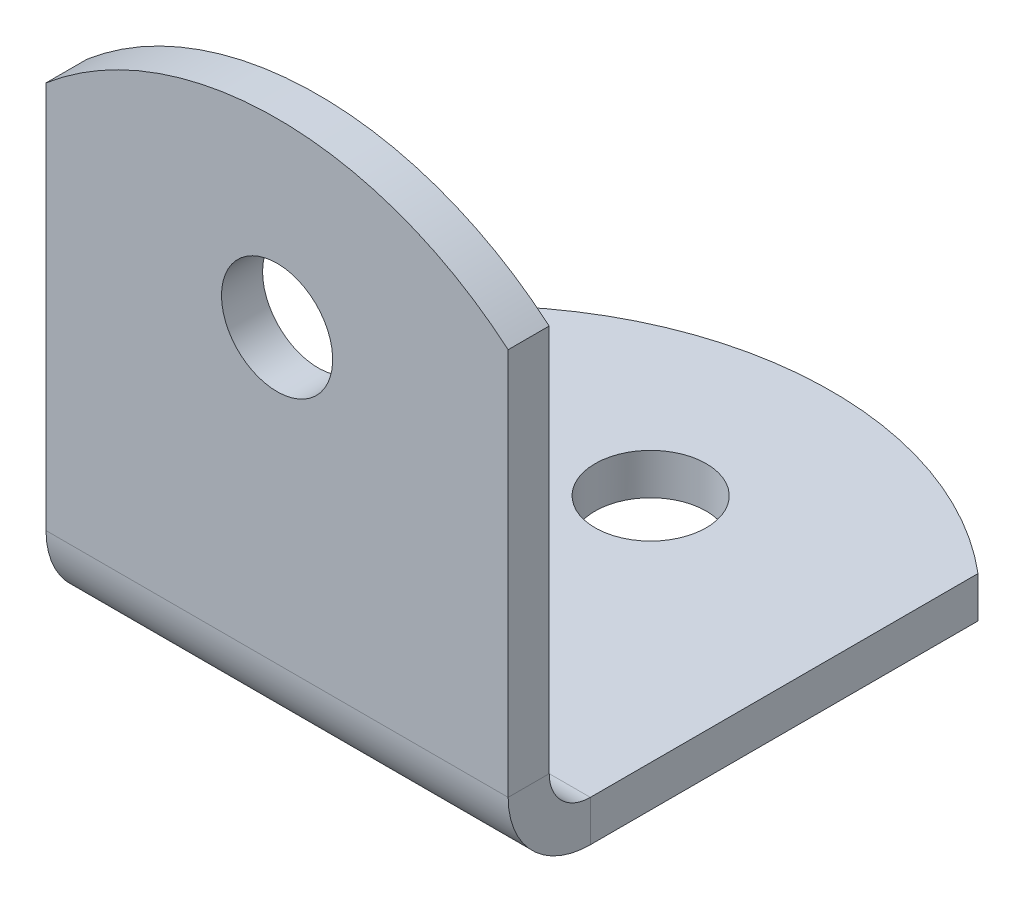
ISO-10303-21;
HEADER;
FILE_DESCRIPTION(('STEP AP214'),'2;1');
FILE_NAME('part.step','',(''),(''),'','','');
FILE_SCHEMA(('AUTOMOTIVE_DESIGN { 1 0 10303 214 1 1 1 1 }'));
ENDSEC;
DATA;
#1=APPLICATION_CONTEXT('core data for automotive mechanical design processes');
#2=APPLICATION_PROTOCOL_DEFINITION('international standard','automotive_design',2000,#1);
#3=PRODUCT_CONTEXT('',#1,'mechanical');
#4=PRODUCT('Part','Part','',(#3));
#5=PRODUCT_RELATED_PRODUCT_CATEGORY('part','',(#4));
#6=PRODUCT_DEFINITION_FORMATION('','',#4);
#7=PRODUCT_DEFINITION_CONTEXT('part definition',#1,'design');
#8=PRODUCT_DEFINITION('design','',#6,#7);
#9=PRODUCT_DEFINITION_SHAPE('','',#8);
#10=(LENGTH_UNIT() NAMED_UNIT(*) SI_UNIT(.MILLI.,.METRE.));
#11=(NAMED_UNIT(*) PLANE_ANGLE_UNIT() SI_UNIT($,.RADIAN.));
#12=(NAMED_UNIT(*) SI_UNIT($,.STERADIAN.) SOLID_ANGLE_UNIT());
#13=UNCERTAINTY_MEASURE_WITH_UNIT(LENGTH_MEASURE(1.E-05),#10,'distance_accuracy_value','');
#14=(GEOMETRIC_REPRESENTATION_CONTEXT(3) GLOBAL_UNCERTAINTY_ASSIGNED_CONTEXT((#13)) GLOBAL_UNIT_ASSIGNED_CONTEXT((#10,
#11,#12)) REPRESENTATION_CONTEXT('',''));
#15=CARTESIAN_POINT('',(0.,0.,0.));
#16=DIRECTION('',(0.,0.,1.));
#17=DIRECTION('',(1.,0.,0.));
#18=AXIS2_PLACEMENT_3D('',#15,#16,#17);
#19=CARTESIAN_POINT('',(0.,0.,-1.5));
#20=DIRECTION('',(-1.,0.,0.));
#21=DIRECTION('',(0.,1.,0.));
#22=AXIS2_PLACEMENT_3D('',#19,#20,#21);
#23=PLANE('',#22);
#24=DIRECTION('',(0.,0.,-1.));
#25=VECTOR('',#24,1.);
#26=CARTESIAN_POINT('',(0.,3.1,-1.5));
#27=LINE('',#26,#25);
#28=CARTESIAN_POINT('',(0.,3.1,0.0999999999999998));
#29=VERTEX_POINT('',#28);
#30=CARTESIAN_POINT('',(0.,3.1,-1.5));
#31=VERTEX_POINT('',#30);
#32=EDGE_CURVE('E11',#29,#31,#27,.T.);
#33=ORIENTED_EDGE('',*,*,#32,.F.);
#34=DIRECTION('',(0.,1.,0.));
#35=VECTOR('',#34,1.);
#36=CARTESIAN_POINT('',(0.,0.,0.1));
#37=LINE('',#36,#35);
#38=CARTESIAN_POINT('',(0.,18.2,0.1));
#39=VERTEX_POINT('',#38);
#40=EDGE_CURVE('E85',#39,#29,#37,.F.);
#41=ORIENTED_EDGE('',*,*,#40,.F.);
#42=DIRECTION('',(0.,0.,-1.));
#43=VECTOR('',#42,1.);
#44=CARTESIAN_POINT('',(0.,18.2,-1.5));
#45=LINE('',#44,#43);
#46=CARTESIAN_POINT('',(0.,18.2,-1.5));
#47=VERTEX_POINT('',#46);
#48=EDGE_CURVE('E46',#39,#47,#45,.T.);
#49=ORIENTED_EDGE('',*,*,#48,.T.);
#50=DIRECTION('',(0.,1.,0.));
#51=VECTOR('',#50,1.);
#52=CARTESIAN_POINT('',(0.,0.,-1.5));
#53=LINE('',#52,#51);
#54=EDGE_CURVE('E87',#47,#31,#53,.F.);
#55=ORIENTED_EDGE('',*,*,#54,.T.);
#56=EDGE_LOOP('',(#33,#41,#49,#55));
#57=FACE_BOUND('',#56,.T.);
#58=ADVANCED_FACE('F36',(#57),#23,.T.);
#59=CARTESIAN_POINT('',(9.,7.57727272727273,-1.5));
#60=DIRECTION('',(0.,0.,1.));
#61=DIRECTION('',(1.,0.,0.));
#62=AXIS2_PLACEMENT_3D('',#59,#60,#61);
#63=CYLINDRICAL_SURFACE('',#62,13.9227272727273);
#64=ORIENTED_EDGE('',*,*,#48,.F.);
#65=CARTESIAN_POINT('',(9.,7.57727272727273,0.1));
#66=DIRECTION('',(0.,0.,1.));
#67=DIRECTION('',(1.,0.,0.));
#68=AXIS2_PLACEMENT_3D('',#65,#66,#67);
#69=CIRCLE('',#68,13.9227272727273);
#70=CARTESIAN_POINT('',(18.,18.2,0.1));
#71=VERTEX_POINT('',#70);
#72=EDGE_CURVE('E111',#71,#39,#69,.T.);
#73=ORIENTED_EDGE('',*,*,#72,.F.);
#74=DIRECTION('',(0.,0.,-1.));
#75=VECTOR('',#74,1.);
#76=CARTESIAN_POINT('',(18.,18.2,-1.5));
#77=LINE('',#76,#75);
#78=CARTESIAN_POINT('',(18.,18.2,-1.5));
#79=VERTEX_POINT('',#78);
#80=EDGE_CURVE('E138',#71,#79,#77,.T.);
#81=ORIENTED_EDGE('',*,*,#80,.T.);
#82=CARTESIAN_POINT('',(9.,7.57727272727273,-1.5));
#83=DIRECTION('',(0.,0.,1.));
#84=DIRECTION('',(1.,0.,0.));
#85=AXIS2_PLACEMENT_3D('',#82,#83,#84);
#86=CIRCLE('',#85,13.9227272727273);
#87=EDGE_CURVE('E151',#79,#47,#86,.T.);
#88=ORIENTED_EDGE('',*,*,#87,.T.);
#89=EDGE_LOOP('',(#64,#73,#81,#88));
#90=FACE_BOUND('',#89,.T.);
#91=ADVANCED_FACE('F158',(#90),#63,.T.);
#92=CARTESIAN_POINT('',(18.,0.,-1.5));
#93=DIRECTION('',(-1.,0.,0.));
#94=DIRECTION('',(0.,1.,0.));
#95=AXIS2_PLACEMENT_3D('',#92,#93,#94);
#96=PLANE('',#95);
#97=ORIENTED_EDGE('',*,*,#80,.F.);
#98=DIRECTION('',(0.,1.,0.));
#99=VECTOR('',#98,1.);
#100=CARTESIAN_POINT('',(18.,0.,0.1));
#101=LINE('',#100,#99);
#102=CARTESIAN_POINT('',(18.,3.1,0.1));
#103=VERTEX_POINT('',#102);
#104=EDGE_CURVE('E113',#71,#103,#101,.F.);
#105=ORIENTED_EDGE('',*,*,#104,.T.);
#106=DIRECTION('',(0.,0.,-1.));
#107=VECTOR('',#106,1.);
#108=CARTESIAN_POINT('',(18.,3.1,-1.5));
#109=LINE('',#108,#107);
#110=CARTESIAN_POINT('',(18.,3.1,-1.5));
#111=VERTEX_POINT('',#110);
#112=EDGE_CURVE('E135',#103,#111,#109,.T.);
#113=ORIENTED_EDGE('',*,*,#112,.T.);
#114=DIRECTION('',(0.,1.,0.));
#115=VECTOR('',#114,1.);
#116=CARTESIAN_POINT('',(18.,0.,-1.5));
#117=LINE('',#116,#115);
#118=EDGE_CURVE('E156',#79,#111,#117,.F.);
#119=ORIENTED_EDGE('',*,*,#118,.F.);
#120=EDGE_LOOP('',(#97,#105,#113,#119));
#121=FACE_BOUND('',#120,.T.);
#122=ADVANCED_FACE('F193',(#121),#96,.F.);
#123=CARTESIAN_POINT('',(18.,3.1,-3.1));
#124=DIRECTION('',(-1.,0.,0.));
#125=DIRECTION('',(0.,0.,1.));
#126=AXIS2_PLACEMENT_3D('',#123,#124,#125);
#127=PLANE('',#126);
#128=ORIENTED_EDGE('',*,*,#112,.F.);
#129=CARTESIAN_POINT('',(18.,3.1,-3.1));
#130=DIRECTION('',(1.,0.,0.));
#131=DIRECTION('',(0.,0.,-1.));
#132=AXIS2_PLACEMENT_3D('',#129,#130,#131);
#133=CIRCLE('',#132,3.2);
#134=CARTESIAN_POINT('',(18.,-0.0999999999999998,-3.1));
#135=VERTEX_POINT('',#134);
#136=EDGE_CURVE('E101',#103,#135,#133,.T.);
#137=ORIENTED_EDGE('',*,*,#136,.T.);
#138=DIRECTION('',(0.,1.,0.));
#139=VECTOR('',#138,1.);
#140=CARTESIAN_POINT('',(18.,1.5,-3.1));
#141=LINE('',#140,#139);
#142=CARTESIAN_POINT('',(18.,1.5,-3.1));
#143=VERTEX_POINT('',#142);
#144=EDGE_CURVE('E133',#135,#143,#141,.T.);
#145=ORIENTED_EDGE('',*,*,#144,.T.);
#146=CARTESIAN_POINT('',(18.,3.1,-3.1));
#147=DIRECTION('',(1.,0.,0.));
#148=DIRECTION('',(0.,0.,-1.));
#149=AXIS2_PLACEMENT_3D('',#146,#147,#148);
#150=CIRCLE('',#149,1.6);
#151=EDGE_CURVE('E163',#111,#143,#150,.T.);
#152=ORIENTED_EDGE('',*,*,#151,.F.);
#153=EDGE_LOOP('',(#128,#137,#145,#152));
#154=FACE_BOUND('',#153,.T.);
#155=ADVANCED_FACE('F200',(#154),#127,.F.);
#156=CARTESIAN_POINT('',(18.,1.5,0.));
#157=DIRECTION('',(1.,0.,0.));
#158=DIRECTION('',(0.,0.,-1.));
#159=AXIS2_PLACEMENT_3D('',#156,#157,#158);
#160=PLANE('',#159);
#161=ORIENTED_EDGE('',*,*,#144,.F.);
#162=DIRECTION('',(0.,0.,1.));
#163=VECTOR('',#162,1.);
#164=CARTESIAN_POINT('',(18.,-0.1,0.));
#165=LINE('',#164,#163);
#166=CARTESIAN_POINT('',(18.,-0.1,-18.2));
#167=VERTEX_POINT('',#166);
#168=EDGE_CURVE('E112',#135,#167,#165,.F.);
#169=ORIENTED_EDGE('',*,*,#168,.T.);
#170=DIRECTION('',(0.,1.,0.));
#171=VECTOR('',#170,1.);
#172=CARTESIAN_POINT('',(18.,1.5,-18.2));
#173=LINE('',#172,#171);
#174=CARTESIAN_POINT('',(18.,1.5,-18.2));
#175=VERTEX_POINT('',#174);
#176=EDGE_CURVE('E130',#167,#175,#173,.T.);
#177=ORIENTED_EDGE('',*,*,#176,.T.);
#178=DIRECTION('',(0.,0.,-1.));
#179=VECTOR('',#178,1.);
#180=CARTESIAN_POINT('',(18.,1.5,0.));
#181=LINE('',#180,#179);
#182=EDGE_CURVE('E155',#143,#175,#181,.T.);
#183=ORIENTED_EDGE('',*,*,#182,.F.);
#184=EDGE_LOOP('',(#161,#169,#177,#183));
#185=FACE_BOUND('',#184,.T.);
#186=ADVANCED_FACE('F215',(#185),#160,.T.);
#187=CARTESIAN_POINT('',(9.,1.5,-7.57727272727273));
#188=DIRECTION('',(0.,1.,0.));
#189=DIRECTION('',(0.,0.,1.));
#190=AXIS2_PLACEMENT_3D('',#187,#188,#189);
#191=CYLINDRICAL_SURFACE('',#190,13.9227272727273);
#192=ORIENTED_EDGE('',*,*,#176,.F.);
#193=CARTESIAN_POINT('',(9.,-0.0999999999999983,-7.57727272727273));
#194=DIRECTION('',(0.,1.,0.));
#195=DIRECTION('',(0.,0.,1.));
#196=AXIS2_PLACEMENT_3D('',#193,#194,#195);
#197=CIRCLE('',#196,13.9227272727273);
#198=CARTESIAN_POINT('',(0.,-0.1,-18.2));
#199=VERTEX_POINT('',#198);
#200=EDGE_CURVE('E187',#167,#199,#197,.T.);
#201=ORIENTED_EDGE('',*,*,#200,.T.);
#202=DIRECTION('',(0.,1.,0.));
#203=VECTOR('',#202,1.);
#204=CARTESIAN_POINT('',(0.,1.5,-18.2));
#205=LINE('',#204,#203);
#206=CARTESIAN_POINT('',(0.,1.5,-18.2));
#207=VERTEX_POINT('',#206);
#208=EDGE_CURVE('E127',#199,#207,#205,.T.);
#209=ORIENTED_EDGE('',*,*,#208,.T.);
#210=CARTESIAN_POINT('',(9.,1.5,-7.57727272727273));
#211=DIRECTION('',(0.,1.,0.));
#212=DIRECTION('',(1.,0.,0.));
#213=AXIS2_PLACEMENT_3D('',#210,#211,#212);
#214=CIRCLE('',#213,13.9227272727273);
#215=EDGE_CURVE('E168',#175,#207,#214,.T.);
#216=ORIENTED_EDGE('',*,*,#215,.F.);
#217=EDGE_LOOP('',(#192,#201,#209,#216));
#218=FACE_BOUND('',#217,.T.);
#219=ADVANCED_FACE('F218',(#218),#191,.T.);
#220=CARTESIAN_POINT('',(0.,1.5,0.));
#221=DIRECTION('',(1.,0.,0.));
#222=DIRECTION('',(0.,0.,-1.));
#223=AXIS2_PLACEMENT_3D('',#220,#221,#222);
#224=PLANE('',#223);
#225=ORIENTED_EDGE('',*,*,#208,.F.);
#226=DIRECTION('',(0.,0.,1.));
#227=VECTOR('',#226,1.);
#228=CARTESIAN_POINT('',(0.,-0.1,0.));
#229=LINE('',#228,#227);
#230=CARTESIAN_POINT('',(0.,-0.1,-3.1));
#231=VERTEX_POINT('',#230);
#232=EDGE_CURVE('E124',#231,#199,#229,.F.);
#233=ORIENTED_EDGE('',*,*,#232,.F.);
#234=DIRECTION('',(0.,1.,0.));
#235=VECTOR('',#234,1.);
#236=CARTESIAN_POINT('',(0.,1.5,-3.1));
#237=LINE('',#236,#235);
#238=CARTESIAN_POINT('',(0.,1.5,-3.1));
#239=VERTEX_POINT('',#238);
#240=EDGE_CURVE('E40',#231,#239,#237,.T.);
#241=ORIENTED_EDGE('',*,*,#240,.T.);
#242=DIRECTION('',(0.,0.,-1.));
#243=VECTOR('',#242,1.);
#244=CARTESIAN_POINT('',(0.,1.5,0.));
#245=LINE('',#244,#243);
#246=EDGE_CURVE('E171',#239,#207,#245,.T.);
#247=ORIENTED_EDGE('',*,*,#246,.T.);
#248=EDGE_LOOP('',(#225,#233,#241,#247));
#249=FACE_BOUND('',#248,.T.);
#250=ADVANCED_FACE('F210',(#249),#224,.F.);
#251=CARTESIAN_POINT('',(9.,14.45,-1.5));
#252=DIRECTION('',(0.,0.,-1.));
#253=DIRECTION('',(-1.,0.,0.));
#254=AXIS2_PLACEMENT_3D('',#251,#252,#253);
#255=CYLINDRICAL_SURFACE('',#254,2.165);
#256=CARTESIAN_POINT('',(9.,14.45,-1.5));
#257=DIRECTION('',(0.,0.,-1.));
#258=DIRECTION('',(-1.,0.,0.));
#259=AXIS2_PLACEMENT_3D('',#256,#257,#258);
#260=CIRCLE('',#259,2.165);
#261=CARTESIAN_POINT('',(6.835,14.45,-1.5));
#262=VERTEX_POINT('',#261);
#263=EDGE_CURVE('E159',#262,#262,#260,.T.);
#264=ORIENTED_EDGE('',*,*,#263,.T.);
#265=EDGE_LOOP('',(#264));
#266=FACE_BOUND('',#265,.T.);
#267=CARTESIAN_POINT('',(9.,14.45,0.1));
#268=DIRECTION('',(0.,0.,-1.));
#269=DIRECTION('',(-1.,0.,0.));
#270=AXIS2_PLACEMENT_3D('',#267,#268,#269);
#271=CIRCLE('',#270,2.165);
#272=CARTESIAN_POINT('',(6.835,14.45,0.1));
#273=VERTEX_POINT('',#272);
#274=EDGE_CURVE('E118',#273,#273,#271,.T.);
#275=ORIENTED_EDGE('',*,*,#274,.F.);
#276=EDGE_LOOP('',(#275));
#277=FACE_BOUND('',#276,.T.);
#278=ADVANCED_FACE('F38',(#266,#277),#255,.F.);
#279=CARTESIAN_POINT('',(0.,3.1,-3.1));
#280=DIRECTION('',(1.,0.,0.));
#281=DIRECTION('',(0.,0.,-1.));
#282=AXIS2_PLACEMENT_3D('',#279,#280,#281);
#283=PLANE('',#282);
#284=CARTESIAN_POINT('',(0.,3.1,-3.1));
#285=DIRECTION('',(1.,0.,0.));
#286=DIRECTION('',(0.,0.,-1.));
#287=AXIS2_PLACEMENT_3D('',#284,#285,#286);
#288=CIRCLE('',#287,3.2);
#289=EDGE_CURVE('E99',#231,#29,#288,.F.);
#290=ORIENTED_EDGE('',*,*,#289,.T.);
#291=ORIENTED_EDGE('',*,*,#32,.T.);
#292=CARTESIAN_POINT('',(0.,3.1,-3.1));
#293=DIRECTION('',(-1.,0.,0.));
#294=DIRECTION('',(0.,0.,1.));
#295=AXIS2_PLACEMENT_3D('',#292,#293,#294);
#296=CIRCLE('',#295,1.6);
#297=EDGE_CURVE('E180',#239,#31,#296,.T.);
#298=ORIENTED_EDGE('',*,*,#297,.F.);
#299=ORIENTED_EDGE('',*,*,#240,.F.);
#300=EDGE_LOOP('',(#290,#291,#298,#299));
#301=FACE_BOUND('',#300,.T.);
#302=ADVANCED_FACE('F115',(#301),#283,.F.);
#303=CARTESIAN_POINT('',(9.,1.5,-14.45));
#304=DIRECTION('',(0.,-1.,0.));
#305=DIRECTION('',(0.,0.,-1.));
#306=AXIS2_PLACEMENT_3D('',#303,#304,#305);
#307=CYLINDRICAL_SURFACE('',#306,2.165);
#308=CARTESIAN_POINT('',(9.,1.5,-14.45));
#309=DIRECTION('',(0.,-1.,0.));
#310=DIRECTION('',(-1.,0.,0.));
#311=AXIS2_PLACEMENT_3D('',#308,#309,#310);
#312=CIRCLE('',#311,2.165);
#313=CARTESIAN_POINT('',(6.835,1.5,-14.45));
#314=VERTEX_POINT('',#313);
#315=EDGE_CURVE('E173',#314,#314,#312,.T.);
#316=ORIENTED_EDGE('',*,*,#315,.F.);
#317=EDGE_LOOP('',(#316));
#318=FACE_BOUND('',#317,.T.);
#319=CARTESIAN_POINT('',(9.,-0.0999999999999968,-14.45));
#320=DIRECTION('',(0.,-1.,0.));
#321=DIRECTION('',(0.,0.,-1.));
#322=AXIS2_PLACEMENT_3D('',#319,#320,#321);
#323=CIRCLE('',#322,2.165);
#324=CARTESIAN_POINT('',(9.,-0.0999999999999958,-16.615));
#325=VERTEX_POINT('',#324);
#326=EDGE_CURVE('E106',#325,#325,#323,.T.);
#327=ORIENTED_EDGE('',*,*,#326,.T.);
#328=EDGE_LOOP('',(#327));
#329=FACE_BOUND('',#328,.T.);
#330=ADVANCED_FACE('F236',(#318,#329),#307,.F.);
#331=CARTESIAN_POINT('',(18.,1.5,0.));
#332=DIRECTION('',(0.,1.,0.));
#333=DIRECTION('',(0.,0.,1.));
#334=AXIS2_PLACEMENT_3D('',#331,#332,#333);
#335=PLANE('',#334);
#336=ORIENTED_EDGE('',*,*,#246,.F.);
#337=DIRECTION('',(-1.,0.,0.));
#338=VECTOR('',#337,1.);
#339=CARTESIAN_POINT('',(18.,1.5,-3.1));
#340=LINE('',#339,#338);
#341=EDGE_CURVE('E177',#239,#143,#340,.F.);
#342=ORIENTED_EDGE('',*,*,#341,.T.);
#343=ORIENTED_EDGE('',*,*,#182,.T.);
#344=ORIENTED_EDGE('',*,*,#215,.T.);
#345=EDGE_LOOP('',(#336,#342,#343,#344));
#346=FACE_BOUND('',#345,.T.);
#347=ORIENTED_EDGE('',*,*,#315,.T.);
#348=EDGE_LOOP('',(#347));
#349=FACE_BOUND('',#348,.T.);
#350=ADVANCED_FACE('F207',(#346,#349),#335,.T.);
#351=CARTESIAN_POINT('',(18.,0.,-1.5));
#352=DIRECTION('',(0.,0.,-1.));
#353=DIRECTION('',(-1.,0.,0.));
#354=AXIS2_PLACEMENT_3D('',#351,#352,#353);
#355=PLANE('',#354);
#356=ORIENTED_EDGE('',*,*,#263,.F.);
#357=EDGE_LOOP('',(#356));
#358=FACE_BOUND('',#357,.T.);
#359=ORIENTED_EDGE('',*,*,#118,.T.);
#360=DIRECTION('',(-1.,0.,0.));
#361=VECTOR('',#360,1.);
#362=CARTESIAN_POINT('',(0.,3.1,-1.5));
#363=LINE('',#362,#361);
#364=EDGE_CURVE('E154',#111,#31,#363,.T.);
#365=ORIENTED_EDGE('',*,*,#364,.T.);
#366=ORIENTED_EDGE('',*,*,#54,.F.);
#367=ORIENTED_EDGE('',*,*,#87,.F.);
#368=EDGE_LOOP('',(#359,#365,#366,#367));
#369=FACE_BOUND('',#368,.T.);
#370=ADVANCED_FACE('F150',(#358,#369),#355,.T.);
#371=CARTESIAN_POINT('',(18.,3.1,-3.1));
#372=DIRECTION('',(1.,0.,0.));
#373=DIRECTION('',(0.,0.,-1.));
#374=AXIS2_PLACEMENT_3D('',#371,#372,#373);
#375=CYLINDRICAL_SURFACE('',#374,1.6);
#376=ORIENTED_EDGE('',*,*,#151,.T.);
#377=ORIENTED_EDGE('',*,*,#341,.F.);
#378=ORIENTED_EDGE('',*,*,#297,.T.);
#379=ORIENTED_EDGE('',*,*,#364,.F.);
#380=EDGE_LOOP('',(#376,#377,#378,#379));
#381=FACE_BOUND('',#380,.T.);
#382=ADVANCED_FACE('F204',(#381),#375,.F.);
#383=CARTESIAN_POINT('',(18.,-0.1,0.));
#384=DIRECTION('',(0.,1.,0.));
#385=DIRECTION('',(0.,0.,1.));
#386=AXIS2_PLACEMENT_3D('',#383,#384,#385);
#387=PLANE('',#386);
#388=ORIENTED_EDGE('',*,*,#232,.T.);
#389=ORIENTED_EDGE('',*,*,#200,.F.);
#390=ORIENTED_EDGE('',*,*,#168,.F.);
#391=DIRECTION('',(1.,0.,0.));
#392=VECTOR('',#391,1.);
#393=CARTESIAN_POINT('',(18.,-0.1,-3.1));
#394=LINE('',#393,#392);
#395=EDGE_CURVE('E105',#231,#135,#394,.T.);
#396=ORIENTED_EDGE('',*,*,#395,.F.);
#397=EDGE_LOOP('',(#388,#389,#390,#396));
#398=FACE_BOUND('',#397,.T.);
#399=ORIENTED_EDGE('',*,*,#326,.F.);
#400=EDGE_LOOP('',(#399));
#401=FACE_BOUND('',#400,.T.);
#402=ADVANCED_FACE('F247',(#398,#401),#387,.F.);
#403=CARTESIAN_POINT('',(18.,0.,0.1));
#404=DIRECTION('',(0.,0.,-1.));
#405=DIRECTION('',(-1.,0.,0.));
#406=AXIS2_PLACEMENT_3D('',#403,#404,#405);
#407=PLANE('',#406);
#408=ORIENTED_EDGE('',*,*,#274,.T.);
#409=EDGE_LOOP('',(#408));
#410=FACE_BOUND('',#409,.T.);
#411=ORIENTED_EDGE('',*,*,#104,.F.);
#412=ORIENTED_EDGE('',*,*,#72,.T.);
#413=ORIENTED_EDGE('',*,*,#40,.T.);
#414=DIRECTION('',(-1.,0.,0.));
#415=VECTOR('',#414,1.);
#416=CARTESIAN_POINT('',(18.,3.1,0.1));
#417=LINE('',#416,#415);
#418=EDGE_CURVE('E96',#103,#29,#417,.T.);
#419=ORIENTED_EDGE('',*,*,#418,.F.);
#420=EDGE_LOOP('',(#411,#412,#413,#419));
#421=FACE_BOUND('',#420,.T.);
#422=ADVANCED_FACE('F109',(#410,#421),#407,.F.);
#423=CARTESIAN_POINT('',(18.,3.1,-3.1));
#424=DIRECTION('',(1.,0.,0.));
#425=DIRECTION('',(0.,0.,-1.));
#426=AXIS2_PLACEMENT_3D('',#423,#424,#425);
#427=CYLINDRICAL_SURFACE('',#426,3.2);
#428=ORIENTED_EDGE('',*,*,#136,.F.);
#429=ORIENTED_EDGE('',*,*,#418,.T.);
#430=ORIENTED_EDGE('',*,*,#289,.F.);
#431=ORIENTED_EDGE('',*,*,#395,.T.);
#432=EDGE_LOOP('',(#428,#429,#430,#431));
#433=FACE_BOUND('',#432,.T.);
#434=ADVANCED_FACE('F97',(#433),#427,.T.);
#435=CLOSED_SHELL('',(#58,#91,#122,#155,#186,#219,#250,#278,#302,#330,#350,#370,#382,#402,#422,#434));
#436=MANIFOLD_SOLID_BREP('B2',#435);
#437=ADVANCED_BREP_SHAPE_REPRESENTATION('',(#18,#436),#14);
#438=SHAPE_DEFINITION_REPRESENTATION(#9,#437);
ENDSEC;
END-ISO-10303-21;
